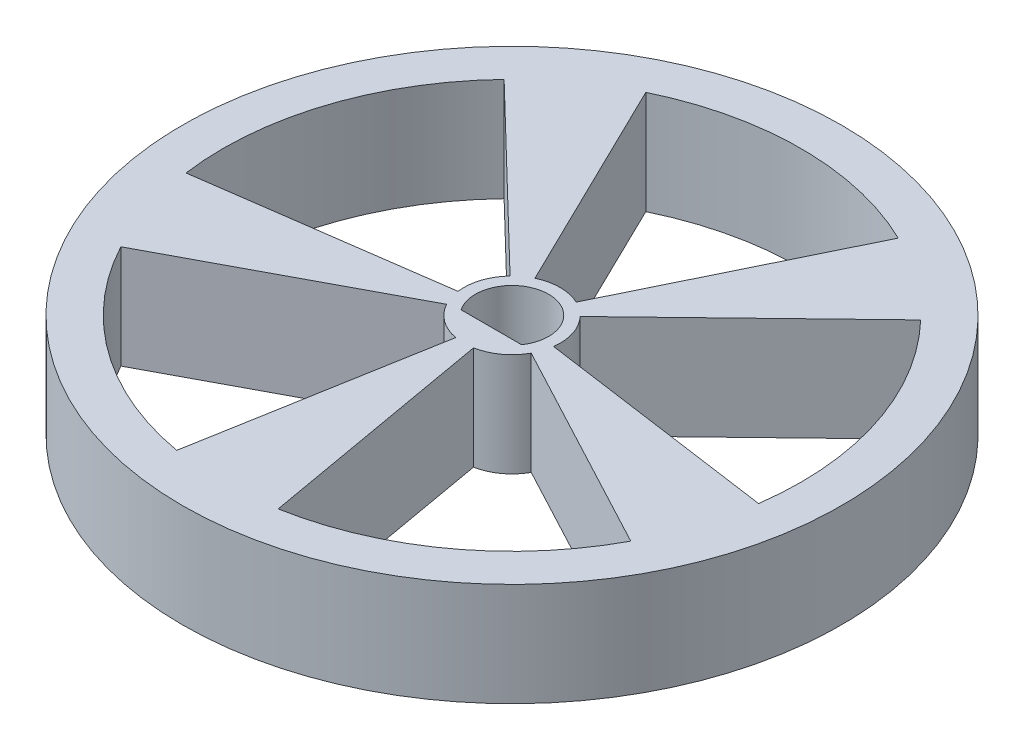
ISO-10303-21;
HEADER;
FILE_DESCRIPTION(('STEP AP214'),'2;1');
FILE_NAME('part.step','',(''),(''),'','','');
FILE_SCHEMA(('AUTOMOTIVE_DESIGN { 1 0 10303 214 1 1 1 1 }'));
ENDSEC;
DATA;
#1=APPLICATION_CONTEXT('core data for automotive mechanical design processes');
#2=APPLICATION_PROTOCOL_DEFINITION('international standard','automotive_design',2000,#1);
#3=PRODUCT_CONTEXT('',#1,'mechanical');
#4=PRODUCT('Part','Part','',(#3));
#5=PRODUCT_RELATED_PRODUCT_CATEGORY('part','',(#4));
#6=PRODUCT_DEFINITION_FORMATION('','',#4);
#7=PRODUCT_DEFINITION_CONTEXT('part definition',#1,'design');
#8=PRODUCT_DEFINITION('design','',#6,#7);
#9=PRODUCT_DEFINITION_SHAPE('','',#8);
#10=(LENGTH_UNIT() NAMED_UNIT(*) SI_UNIT(.MILLI.,.METRE.));
#11=(NAMED_UNIT(*) PLANE_ANGLE_UNIT() SI_UNIT($,.RADIAN.));
#12=(NAMED_UNIT(*) SI_UNIT($,.STERADIAN.) SOLID_ANGLE_UNIT());
#13=UNCERTAINTY_MEASURE_WITH_UNIT(LENGTH_MEASURE(1.E-05),#10,'distance_accuracy_value','');
#14=(GEOMETRIC_REPRESENTATION_CONTEXT(3) GLOBAL_UNCERTAINTY_ASSIGNED_CONTEXT((#13)) GLOBAL_UNIT_ASSIGNED_CONTEXT((#10,
#11,#12)) REPRESENTATION_CONTEXT('',''));
#15=CARTESIAN_POINT('',(0.,0.,0.));
#16=DIRECTION('',(0.,0.,1.));
#17=DIRECTION('',(1.,0.,0.));
#18=AXIS2_PLACEMENT_3D('',#15,#16,#17);
#19=CARTESIAN_POINT('',(-0.0194735546445685,3.81,-0.00343371309413793));
#20=DIRECTION('',(-0.984807753012209,0.,-0.173648177666923));
#21=DIRECTION('',(-0.173648177666923,0.,0.984807753012209));
#22=AXIS2_PLACEMENT_3D('',#19,#20,#21);
#23=PLANE('',#22);
#24=DIRECTION('',(0.173648177666923,0.,-0.984807753012209));
#25=VECTOR('',#24,1.);
#26=CARTESIAN_POINT('',(-0.0194735546445685,0.,-0.00343371309413793));
#27=LINE('',#26,#25);
#28=CARTESIAN_POINT('',(-1.87031075779216,0.,10.4931856681893));
#29=VERTEX_POINT('',#28);
#30=CARTESIAN_POINT('',(-0.32820091998509,0.,1.74744618118011));
#31=VERTEX_POINT('',#30);
#32=EDGE_CURVE('E311',#29,#31,#27,.T.);
#33=ORIENTED_EDGE('',*,*,#32,.F.);
#34=DIRECTION('',(0.,-1.,0.));
#35=VECTOR('',#34,1.);
#36=CARTESIAN_POINT('',(-1.87031075779216,3.81,10.4931856681893));
#37=LINE('',#36,#35);
#38=CARTESIAN_POINT('',(-1.87031075779216,3.81,10.4931856681893));
#39=VERTEX_POINT('',#38);
#40=EDGE_CURVE('E47',#39,#29,#37,.T.);
#41=ORIENTED_EDGE('',*,*,#40,.F.);
#42=DIRECTION('',(0.173648177666923,0.,-0.984807753012209));
#43=VECTOR('',#42,1.);
#44=CARTESIAN_POINT('',(-0.0194735546445685,3.81,-0.00343371309413793));
#45=LINE('',#44,#43);
#46=CARTESIAN_POINT('',(-0.32820091998509,3.81,1.74744618118011));
#47=VERTEX_POINT('',#46);
#48=EDGE_CURVE('E218',#39,#47,#45,.T.);
#49=ORIENTED_EDGE('',*,*,#48,.T.);
#50=DIRECTION('',(0.,-1.,0.));
#51=VECTOR('',#50,1.);
#52=CARTESIAN_POINT('',(-0.32820091998509,3.81,1.74744618118011));
#53=LINE('',#52,#51);
#54=EDGE_CURVE('E135',#47,#31,#53,.T.);
#55=ORIENTED_EDGE('',*,*,#54,.T.);
#56=EDGE_LOOP('',(#33,#41,#49,#55));
#57=FACE_BOUND('',#56,.T.);
#58=ADVANCED_FACE('F41',(#57),#23,.T.);
#59=CARTESIAN_POINT('',(0.,3.81,0.));
#60=DIRECTION('',(0.,-1.,0.));
#61=DIRECTION('',(0.,0.,-1.));
#62=AXIS2_PLACEMENT_3D('',#59,#60,#61);
#63=CYLINDRICAL_SURFACE('',#62,10.6585649971188);
#64=CARTESIAN_POINT('',(0.,0.,0.));
#65=DIRECTION('',(0.,1.,0.));
#66=DIRECTION('',(0.,0.,1.));
#67=AXIS2_PLACEMENT_3D('',#64,#65,#66);
#68=CIRCLE('',#67,10.6585649971188);
#69=CARTESIAN_POINT('',(-9.40165479750631,0.,5.02134393029727));
#70=VERTEX_POINT('',#69);
#71=EDGE_CURVE('E202',#70,#29,#68,.T.);
#72=ORIENTED_EDGE('',*,*,#71,.F.);
#73=DIRECTION('',(0.,-1.,0.));
#74=VECTOR('',#73,1.);
#75=CARTESIAN_POINT('',(-9.40165479750631,3.81,5.02134393029727));
#76=LINE('',#75,#74);
#77=CARTESIAN_POINT('',(-9.40165479750631,3.81,5.02134393029727));
#78=VERTEX_POINT('',#77);
#79=EDGE_CURVE('E199',#78,#70,#76,.T.);
#80=ORIENTED_EDGE('',*,*,#79,.F.);
#81=CARTESIAN_POINT('',(0.,3.81,0.));
#82=DIRECTION('',(0.,1.,0.));
#83=DIRECTION('',(0.,0.,1.));
#84=AXIS2_PLACEMENT_3D('',#81,#82,#83);
#85=CIRCLE('',#84,10.6585649971188);
#86=EDGE_CURVE('E205',#78,#39,#85,.T.);
#87=ORIENTED_EDGE('',*,*,#86,.T.);
#88=ORIENTED_EDGE('',*,*,#40,.T.);
#89=EDGE_LOOP('',(#72,#80,#87,#88));
#90=FACE_BOUND('',#89,.T.);
#91=ADVANCED_FACE('F204',(#90),#63,.F.);
#92=CARTESIAN_POINT('',(0.00928331453932777,3.81,0.0174593753402485));
#93=DIRECTION('',(-0.469471562785882,0.,-0.882947592858931));
#94=DIRECTION('',(-0.882947592858932,0.,0.469471562785883));
#95=AXIS2_PLACEMENT_3D('',#92,#93,#94);
#96=PLANE('',#95);
#97=DIRECTION('',(0.882947592858932,0.,-0.469471562785883));
#98=VECTOR('',#97,1.);
#99=CARTESIAN_POINT('',(0.00928331453932777,0.,0.0174593753402485));
#100=LINE('',#99,#98);
#101=CARTESIAN_POINT('',(-1.56050041564154,0.,0.852128190346135));
#102=VERTEX_POINT('',#101);
#103=EDGE_CURVE('E313',#70,#102,#100,.T.);
#104=ORIENTED_EDGE('',*,*,#103,.T.);
#105=DIRECTION('',(0.,-1.,0.));
#106=VECTOR('',#105,1.);
#107=CARTESIAN_POINT('',(-1.56050041564154,3.81,0.852128190346135));
#108=LINE('',#107,#106);
#109=CARTESIAN_POINT('',(-1.56050041564154,3.81,0.852128190346135));
#110=VERTEX_POINT('',#109);
#111=EDGE_CURVE('E209',#110,#102,#108,.T.);
#112=ORIENTED_EDGE('',*,*,#111,.F.);
#113=DIRECTION('',(0.882947592858932,0.,-0.469471562785883));
#114=VECTOR('',#113,1.);
#115=CARTESIAN_POINT('',(0.00928331453932777,3.81,0.0174593753402485));
#116=LINE('',#115,#114);
#117=EDGE_CURVE('E215',#78,#110,#116,.T.);
#118=ORIENTED_EDGE('',*,*,#117,.F.);
#119=ORIENTED_EDGE('',*,*,#79,.T.);
#120=EDGE_LOOP('',(#104,#112,#118,#119));
#121=FACE_BOUND('',#120,.T.);
#122=ADVANCED_FACE('F214',(#121),#96,.F.);
#123=CARTESIAN_POINT('',(-0.013736150731006,3.81,0.0142242004767529));
#124=DIRECTION('',(0.694658370459006,0.,-0.719339800338643));
#125=DIRECTION('',(-0.719339800338643,0.,-0.694658370459006));
#126=AXIS2_PLACEMENT_3D('',#123,#124,#125);
#127=PLANE('',#126);
#128=DIRECTION('',(0.719339800338643,0.,0.694658370459006));
#129=VECTOR('',#128,1.);
#130=CARTESIAN_POINT('',(-0.013736150731006,0.,0.0142242004767529));
#131=LINE('',#130,#129);
#132=CARTESIAN_POINT('',(-7.68085297314452,0.,-7.38982445006264));
#133=VERTEX_POINT('',#132);
#134=CARTESIAN_POINT('',(-1.29264321630989,0.,-1.22080199677426));
#135=VERTEX_POINT('',#134);
#136=EDGE_CURVE('E301',#133,#135,#131,.T.);
#137=ORIENTED_EDGE('',*,*,#136,.T.);
#138=DIRECTION('',(0.,-1.,0.));
#139=VECTOR('',#138,1.);
#140=CARTESIAN_POINT('',(-1.29264321630989,3.81,-1.22080199677426));
#141=LINE('',#140,#139);
#142=CARTESIAN_POINT('',(-1.29264321630989,3.81,-1.22080199677426));
#143=VERTEX_POINT('',#142);
#144=EDGE_CURVE('E324',#143,#135,#141,.T.);
#145=ORIENTED_EDGE('',*,*,#144,.F.);
#146=DIRECTION('',(0.719339800338643,0.,0.694658370459006));
#147=VECTOR('',#146,1.);
#148=CARTESIAN_POINT('',(-0.013736150731006,3.81,0.0142242004767529));
#149=LINE('',#148,#147);
#150=CARTESIAN_POINT('',(-7.68085297314452,3.81,-7.38982445006264));
#151=VERTEX_POINT('',#150);
#152=EDGE_CURVE('E252',#151,#143,#149,.T.);
#153=ORIENTED_EDGE('',*,*,#152,.F.);
#154=DIRECTION('',(0.,-1.,0.));
#155=VECTOR('',#154,1.);
#156=CARTESIAN_POINT('',(-7.68085297314452,3.81,-7.38982445006264));
#157=LINE('',#156,#155);
#158=EDGE_CURVE('E327',#151,#133,#157,.T.);
#159=ORIENTED_EDGE('',*,*,#158,.T.);
#160=EDGE_LOOP('',(#137,#145,#153,#159));
#161=FACE_BOUND('',#160,.T.);
#162=ADVANCED_FACE('F399',(#161),#127,.F.);
#163=CARTESIAN_POINT('',(0.,3.81,0.));
#164=DIRECTION('',(0.,-1.,0.));
#165=DIRECTION('',(0.,0.,-1.));
#166=AXIS2_PLACEMENT_3D('',#163,#164,#165);
#167=CYLINDRICAL_SURFACE('',#166,1.778);
#168=CARTESIAN_POINT('',(0.,0.,0.));
#169=DIRECTION('',(0.,1.,0.));
#170=DIRECTION('',(0.,0.,1.));
#171=AXIS2_PLACEMENT_3D('',#168,#169,#170);
#172=CIRCLE('',#171,1.778);
#173=CARTESIAN_POINT('',(-1.76333973933131,0.,0.227852943134368));
#174=VERTEX_POINT('',#173);
#175=EDGE_CURVE('E302',#135,#174,#172,.T.);
#176=ORIENTED_EDGE('',*,*,#175,.T.);
#177=DIRECTION('',(0.,-1.,0.));
#178=VECTOR('',#177,1.);
#179=CARTESIAN_POINT('',(-1.76333973933131,3.81,0.227852943134368));
#180=LINE('',#179,#178);
#181=CARTESIAN_POINT('',(-1.76333973933131,3.81,0.227852943134368));
#182=VERTEX_POINT('',#181);
#183=EDGE_CURVE('E334',#182,#174,#180,.T.);
#184=ORIENTED_EDGE('',*,*,#183,.F.);
#185=CARTESIAN_POINT('',(0.,3.81,0.));
#186=DIRECTION('',(0.,1.,0.));
#187=DIRECTION('',(0.,0.,1.));
#188=AXIS2_PLACEMENT_3D('',#185,#186,#187);
#189=CIRCLE('',#188,1.778);
#190=EDGE_CURVE('E258',#143,#182,#189,.T.);
#191=ORIENTED_EDGE('',*,*,#190,.F.);
#192=ORIENTED_EDGE('',*,*,#144,.T.);
#193=EDGE_LOOP('',(#176,#184,#191,#192));
#194=FACE_BOUND('',#193,.T.);
#195=ADVANCED_FACE('F395',(#194),#167,.T.);
#196=CARTESIAN_POINT('',(-0.0027520041127929,3.81,-0.0195815267400428));
#197=DIRECTION('',(-0.13917310096007,0.,-0.99026806874157));
#198=DIRECTION('',(-0.99026806874157,0.,0.13917310096007));
#199=AXIS2_PLACEMENT_3D('',#196,#197,#198);
#200=PLANE('',#199);
#201=DIRECTION('',(0.99026806874157,0.,-0.13917310096007));
#202=VECTOR('',#201,1.);
#203=CARTESIAN_POINT('',(-0.0027520041127929,0.,-0.0195815267400428));
#204=LINE('',#203,#202);
#205=CARTESIAN_POINT('',(-10.5575704153464,0.,1.46380146290695));
#206=VERTEX_POINT('',#205);
#207=EDGE_CURVE('E310',#206,#174,#204,.T.);
#208=ORIENTED_EDGE('',*,*,#207,.F.);
#209=DIRECTION('',(0.,-1.,0.));
#210=VECTOR('',#209,1.);
#211=CARTESIAN_POINT('',(-10.5575704153464,3.81,1.46380146290695));
#212=LINE('',#211,#210);
#213=CARTESIAN_POINT('',(-10.5575704153464,3.81,1.46380146290695));
#214=VERTEX_POINT('',#213);
#215=EDGE_CURVE('E328',#214,#206,#212,.T.);
#216=ORIENTED_EDGE('',*,*,#215,.F.);
#217=DIRECTION('',(0.99026806874157,0.,-0.13917310096007));
#218=VECTOR('',#217,1.);
#219=CARTESIAN_POINT('',(-0.0027520041127929,3.81,-0.0195815267400428));
#220=LINE('',#219,#218);
#221=EDGE_CURVE('E228',#214,#182,#220,.T.);
#222=ORIENTED_EDGE('',*,*,#221,.T.);
#223=ORIENTED_EDGE('',*,*,#183,.T.);
#224=EDGE_LOOP('',(#208,#216,#222,#223));
#225=FACE_BOUND('',#224,.T.);
#226=ADVANCED_FACE('F389',(#225),#200,.T.);
#227=CARTESIAN_POINT('',(0.,3.81,0.));
#228=DIRECTION('',(0.,-1.,0.));
#229=DIRECTION('',(0.,0.,-1.));
#230=AXIS2_PLACEMENT_3D('',#227,#228,#229);
#231=CYLINDRICAL_SURFACE('',#230,1.778);
#232=CARTESIAN_POINT('',(0.,0.,0.));
#233=DIRECTION('',(0.,1.,0.));
#234=DIRECTION('',(0.,0.,1.));
#235=AXIS2_PLACEMENT_3D('',#232,#233,#234);
#236=CIRCLE('',#235,1.778);
#237=CARTESIAN_POINT('',(0.328200919985089,0.,1.74744618118011));
#238=VERTEX_POINT('',#237);
#239=CARTESIAN_POINT('',(1.56050041564153,0.,0.852128190346158));
#240=VERTEX_POINT('',#239);
#241=EDGE_CURVE('E292',#238,#240,#236,.T.);
#242=ORIENTED_EDGE('',*,*,#241,.T.);
#243=DIRECTION('',(0.,-1.,0.));
#244=VECTOR('',#243,1.);
#245=CARTESIAN_POINT('',(1.56050041564153,3.81,0.852128190346158));
#246=LINE('',#245,#244);
#247=CARTESIAN_POINT('',(1.56050041564153,3.81,0.852128190346158));
#248=VERTEX_POINT('',#247);
#249=EDGE_CURVE('E329',#248,#240,#246,.T.);
#250=ORIENTED_EDGE('',*,*,#249,.F.);
#251=CARTESIAN_POINT('',(0.,3.81,0.));
#252=DIRECTION('',(0.,1.,0.));
#253=DIRECTION('',(0.,0.,1.));
#254=AXIS2_PLACEMENT_3D('',#251,#252,#253);
#255=CIRCLE('',#254,1.778);
#256=CARTESIAN_POINT('',(0.328200919985089,3.81,1.74744618118011));
#257=VERTEX_POINT('',#256);
#258=EDGE_CURVE('E237',#257,#248,#255,.T.);
#259=ORIENTED_EDGE('',*,*,#258,.F.);
#260=DIRECTION('',(0.,-1.,0.));
#261=VECTOR('',#260,1.);
#262=CARTESIAN_POINT('',(0.328200919985089,3.81,1.74744618118011));
#263=LINE('',#262,#261);
#264=EDGE_CURVE('E332',#257,#238,#263,.T.);
#265=ORIENTED_EDGE('',*,*,#264,.T.);
#266=EDGE_LOOP('',(#242,#250,#259,#265));
#267=FACE_BOUND('',#266,.T.);
#268=ADVANCED_FACE('F392',(#267),#231,.T.);
#269=CARTESIAN_POINT('',(-0.00928331453932883,3.81,0.0174593753402499));
#270=DIRECTION('',(-0.469471562785894,0.,0.882947592858925));
#271=DIRECTION('',(0.882947592858925,0.,0.469471562785895));
#272=AXIS2_PLACEMENT_3D('',#269,#270,#271);
#273=PLANE('',#272);
#274=DIRECTION('',(-0.882947592858925,0.,-0.469471562785895));
#275=VECTOR('',#274,1.);
#276=CARTESIAN_POINT('',(-0.00928331453932883,0.,0.0174593753402499));
#277=LINE('',#276,#275);
#278=CARTESIAN_POINT('',(9.40165479750624,0.,5.0213439302974));
#279=VERTEX_POINT('',#278);
#280=EDGE_CURVE('E294',#279,#240,#277,.T.);
#281=ORIENTED_EDGE('',*,*,#280,.F.);
#282=DIRECTION('',(0.,-1.,0.));
#283=VECTOR('',#282,1.);
#284=CARTESIAN_POINT('',(9.40165479750624,3.81,5.0213439302974));
#285=LINE('',#284,#283);
#286=CARTESIAN_POINT('',(9.40165479750624,3.81,5.0213439302974));
#287=VERTEX_POINT('',#286);
#288=EDGE_CURVE('E342',#287,#279,#285,.T.);
#289=ORIENTED_EDGE('',*,*,#288,.F.);
#290=DIRECTION('',(-0.882947592858925,0.,-0.469471562785895));
#291=VECTOR('',#290,1.);
#292=CARTESIAN_POINT('',(-0.00928331453932883,3.81,0.0174593753402499));
#293=LINE('',#292,#291);
#294=EDGE_CURVE('E243',#287,#248,#293,.T.);
#295=ORIENTED_EDGE('',*,*,#294,.T.);
#296=ORIENTED_EDGE('',*,*,#249,.T.);
#297=EDGE_LOOP('',(#281,#289,#295,#296));
#298=FACE_BOUND('',#297,.T.);
#299=ADVANCED_FACE('F407',(#298),#273,.T.);
#300=CARTESIAN_POINT('',(1.87031075779216,0.,10.4931856681893));
#301=VERTEX_POINT('',#300);
#302=EDGE_CURVE('E296',#301,#279,#68,.T.);
#303=ORIENTED_EDGE('',*,*,#302,.F.);
#304=DIRECTION('',(0.,-1.,0.));
#305=VECTOR('',#304,1.);
#306=CARTESIAN_POINT('',(1.87031075779216,3.81,10.4931856681893));
#307=LINE('',#306,#305);
#308=CARTESIAN_POINT('',(1.87031075779216,3.81,10.4931856681893));
#309=VERTEX_POINT('',#308);
#310=EDGE_CURVE('E336',#309,#301,#307,.T.);
#311=ORIENTED_EDGE('',*,*,#310,.F.);
#312=EDGE_CURVE('E227',#309,#287,#85,.T.);
#313=ORIENTED_EDGE('',*,*,#312,.T.);
#314=ORIENTED_EDGE('',*,*,#288,.T.);
#315=EDGE_LOOP('',(#303,#311,#313,#314));
#316=FACE_BOUND('',#315,.T.);
#317=ADVANCED_FACE('F406',(#316),#63,.F.);
#318=CARTESIAN_POINT('',(0.00275200411279299,3.81,-0.0195815267400415));
#319=DIRECTION('',(-0.139173100960083,0.,0.990268068741568));
#320=DIRECTION('',(0.990268068741568,0.,0.139173100960083));
#321=AXIS2_PLACEMENT_3D('',#318,#319,#320);
#322=PLANE('',#321);
#323=DIRECTION('',(-0.990268068741568,0.,-0.139173100960083));
#324=VECTOR('',#323,1.);
#325=CARTESIAN_POINT('',(0.00275200411279299,0.,-0.0195815267400415));
#326=LINE('',#325,#324);
#327=CARTESIAN_POINT('',(10.5575704153464,0.,1.46380146290709));
#328=VERTEX_POINT('',#327);
#329=CARTESIAN_POINT('',(1.76333973933131,0.,0.227852943134393));
#330=VERTEX_POINT('',#329);
#331=EDGE_CURVE('E285',#328,#330,#326,.T.);
#332=ORIENTED_EDGE('',*,*,#331,.T.);
#333=DIRECTION('',(0.,-1.,0.));
#334=VECTOR('',#333,1.);
#335=CARTESIAN_POINT('',(1.76333973933131,3.81,0.227852943134393));
#336=LINE('',#335,#334);
#337=CARTESIAN_POINT('',(1.76333973933131,3.81,0.227852943134393));
#338=VERTEX_POINT('',#337);
#339=EDGE_CURVE('E339',#338,#330,#336,.T.);
#340=ORIENTED_EDGE('',*,*,#339,.F.);
#341=DIRECTION('',(-0.990268068741568,0.,-0.139173100960083));
#342=VECTOR('',#341,1.);
#343=CARTESIAN_POINT('',(0.00275200411279299,3.81,-0.0195815267400415));
#344=LINE('',#343,#342);
#345=CARTESIAN_POINT('',(10.5575704153464,3.81,1.46380146290709));
#346=VERTEX_POINT('',#345);
#347=EDGE_CURVE('E230',#346,#338,#344,.T.);
#348=ORIENTED_EDGE('',*,*,#347,.F.);
#349=DIRECTION('',(0.,-1.,0.));
#350=VECTOR('',#349,1.);
#351=CARTESIAN_POINT('',(10.5575704153464,3.81,1.46380146290709));
#352=LINE('',#351,#350);
#353=EDGE_CURVE('E341',#346,#328,#352,.T.);
#354=ORIENTED_EDGE('',*,*,#353,.T.);
#355=EDGE_LOOP('',(#332,#340,#348,#354));
#356=FACE_BOUND('',#355,.T.);
#357=ADVANCED_FACE('F423',(#356),#322,.F.);
#358=CARTESIAN_POINT('',(0.,3.81,0.));
#359=DIRECTION('',(0.,-1.,0.));
#360=DIRECTION('',(0.,0.,-1.));
#361=AXIS2_PLACEMENT_3D('',#358,#359,#360);
#362=CYLINDRICAL_SURFACE('',#361,1.778);
#363=CARTESIAN_POINT('',(0.,0.,0.));
#364=DIRECTION('',(0.,1.,0.));
#365=DIRECTION('',(0.,0.,1.));
#366=AXIS2_PLACEMENT_3D('',#363,#364,#365);
#367=CIRCLE('',#366,1.778);
#368=CARTESIAN_POINT('',(1.29264321630991,0.,-1.22080199677424));
#369=VERTEX_POINT('',#368);
#370=EDGE_CURVE('E289',#330,#369,#367,.T.);
#371=ORIENTED_EDGE('',*,*,#370,.T.);
#372=DIRECTION('',(0.,-1.,0.));
#373=VECTOR('',#372,1.);
#374=CARTESIAN_POINT('',(1.29264321630991,3.81,-1.22080199677424));
#375=LINE('',#374,#373);
#376=CARTESIAN_POINT('',(1.29264321630991,3.81,-1.22080199677424));
#377=VERTEX_POINT('',#376);
#378=EDGE_CURVE('E349',#377,#369,#375,.T.);
#379=ORIENTED_EDGE('',*,*,#378,.F.);
#380=CARTESIAN_POINT('',(0.,3.81,0.));
#381=DIRECTION('',(0.,1.,0.));
#382=DIRECTION('',(0.,0.,1.));
#383=AXIS2_PLACEMENT_3D('',#380,#381,#382);
#384=CIRCLE('',#383,1.778);
#385=EDGE_CURVE('E232',#338,#377,#384,.T.);
#386=ORIENTED_EDGE('',*,*,#385,.F.);
#387=ORIENTED_EDGE('',*,*,#339,.T.);
#388=EDGE_LOOP('',(#371,#379,#386,#387));
#389=FACE_BOUND('',#388,.T.);
#390=ADVANCED_FACE('F416',(#389),#362,.T.);
#391=CARTESIAN_POINT('',(0.0137361507310076,3.81,0.0142242004767549));
#392=DIRECTION('',(0.694658370458996,0.,0.719339800338652));
#393=DIRECTION('',(0.719339800338652,0.,-0.694658370458996));
#394=AXIS2_PLACEMENT_3D('',#391,#392,#393);
#395=PLANE('',#394);
#396=DIRECTION('',(-0.719339800338652,0.,0.694658370458996));
#397=VECTOR('',#396,1.);
#398=CARTESIAN_POINT('',(0.0137361507310076,0.,0.0142242004767549));
#399=LINE('',#398,#397);
#400=CARTESIAN_POINT('',(7.68085297314463,0.,-7.38982445006253));
#401=VERTEX_POINT('',#400);
#402=EDGE_CURVE('E288',#401,#369,#399,.T.);
#403=ORIENTED_EDGE('',*,*,#402,.F.);
#404=DIRECTION('',(0.,-1.,0.));
#405=VECTOR('',#404,1.);
#406=CARTESIAN_POINT('',(7.68085297314463,3.81,-7.38982445006253));
#407=LINE('',#406,#405);
#408=CARTESIAN_POINT('',(7.68085297314463,3.81,-7.38982445006253));
#409=VERTEX_POINT('',#408);
#410=EDGE_CURVE('E347',#409,#401,#407,.T.);
#411=ORIENTED_EDGE('',*,*,#410,.F.);
#412=DIRECTION('',(-0.719339800338652,0.,0.694658370458996));
#413=VECTOR('',#412,1.);
#414=CARTESIAN_POINT('',(0.0137361507310076,3.81,0.0142242004767549));
#415=LINE('',#414,#413);
#416=EDGE_CURVE('E239',#409,#377,#415,.T.);
#417=ORIENTED_EDGE('',*,*,#416,.T.);
#418=ORIENTED_EDGE('',*,*,#378,.T.);
#419=EDGE_LOOP('',(#403,#411,#417,#418));
#420=FACE_BOUND('',#419,.T.);
#421=ADVANCED_FACE('F413',(#420),#395,.T.);
#422=CARTESIAN_POINT('',(-0.0177727225656827,3.81,-0.00866833598282365));
#423=DIRECTION('',(0.89879404629916,0.,0.438371146789091));
#424=DIRECTION('',(0.438371146789091,0.,-0.89879404629916));
#425=AXIS2_PLACEMENT_3D('',#422,#423,#424);
#426=PLANE('',#425);
#427=DIRECTION('',(-0.438371146789091,0.,0.89879404629916));
#428=VECTOR('',#427,1.);
#429=CARTESIAN_POINT('',(-0.0177727225656827,0.,-0.00866833598282365));
#430=LINE('',#429,#428);
#431=CARTESIAN_POINT('',(4.65462659751236,0.,-9.58850661133094));
#432=VERTEX_POINT('',#431);
#433=CARTESIAN_POINT('',(0.761602972635052,0.,-1.60662531788636));
#434=VERTEX_POINT('',#433);
#435=EDGE_CURVE('E268',#432,#434,#430,.T.);
#436=ORIENTED_EDGE('',*,*,#435,.T.);
#437=DIRECTION('',(0.,-1.,0.));
#438=VECTOR('',#437,1.);
#439=CARTESIAN_POINT('',(0.761602972635052,3.81,-1.60662531788636));
#440=LINE('',#439,#438);
#441=CARTESIAN_POINT('',(0.761602972635052,3.81,-1.60662531788636));
#442=VERTEX_POINT('',#441);
#443=EDGE_CURVE('E350',#442,#434,#440,.T.);
#444=ORIENTED_EDGE('',*,*,#443,.F.);
#445=DIRECTION('',(-0.438371146789091,0.,0.89879404629916));
#446=VECTOR('',#445,1.);
#447=CARTESIAN_POINT('',(-0.0177727225656827,3.81,-0.00866833598282365));
#448=LINE('',#447,#446);
#449=CARTESIAN_POINT('',(4.65462659751236,3.81,-9.58850661133094));
#450=VERTEX_POINT('',#449);
#451=EDGE_CURVE('E453',#450,#442,#448,.T.);
#452=ORIENTED_EDGE('',*,*,#451,.F.);
#453=DIRECTION('',(0.,-1.,0.));
#454=VECTOR('',#453,1.);
#455=CARTESIAN_POINT('',(4.65462659751236,3.81,-9.58850661133094));
#456=LINE('',#455,#454);
#457=EDGE_CURVE('E355',#450,#432,#456,.T.);
#458=ORIENTED_EDGE('',*,*,#457,.T.);
#459=EDGE_LOOP('',(#436,#444,#452,#458));
#460=FACE_BOUND('',#459,.T.);
#461=ADVANCED_FACE('F419',(#460),#426,.F.);
#462=CARTESIAN_POINT('',(0.,3.81,0.));
#463=DIRECTION('',(0.,-1.,0.));
#464=DIRECTION('',(0.,0.,-1.));
#465=AXIS2_PLACEMENT_3D('',#462,#463,#464);
#466=CYLINDRICAL_SURFACE('',#465,1.778);
#467=CARTESIAN_POINT('',(0.,0.,0.));
#468=DIRECTION('',(0.,1.,0.));
#469=DIRECTION('',(0.,0.,1.));
#470=AXIS2_PLACEMENT_3D('',#467,#468,#469);
#471=CIRCLE('',#470,1.778);
#472=CARTESIAN_POINT('',(-0.761602972635029,0.,-1.60662531788637));
#473=VERTEX_POINT('',#472);
#474=EDGE_CURVE('E275',#434,#473,#471,.T.);
#475=ORIENTED_EDGE('',*,*,#474,.T.);
#476=DIRECTION('',(0.,-1.,0.));
#477=VECTOR('',#476,1.);
#478=CARTESIAN_POINT('',(-0.761602972635029,3.81,-1.60662531788637));
#479=LINE('',#478,#477);
#480=CARTESIAN_POINT('',(-0.761602972635029,3.81,-1.60662531788637));
#481=VERTEX_POINT('',#480);
#482=EDGE_CURVE('E357',#481,#473,#479,.T.);
#483=ORIENTED_EDGE('',*,*,#482,.F.);
#484=CARTESIAN_POINT('',(0.,3.81,0.));
#485=DIRECTION('',(0.,1.,0.));
#486=DIRECTION('',(0.,0.,1.));
#487=AXIS2_PLACEMENT_3D('',#484,#485,#486);
#488=CIRCLE('',#487,1.778);
#489=EDGE_CURVE('E240',#442,#481,#488,.T.);
#490=ORIENTED_EDGE('',*,*,#489,.F.);
#491=ORIENTED_EDGE('',*,*,#443,.T.);
#492=EDGE_LOOP('',(#475,#483,#490,#491));
#493=FACE_BOUND('',#492,.T.);
#494=ADVANCED_FACE('F429',(#493),#466,.T.);
#495=CARTESIAN_POINT('',(0.0177727225656828,3.81,-0.0086683359828234));
#496=DIRECTION('',(0.898794046299166,0.,-0.438371146789079));
#497=DIRECTION('',(-0.438371146789079,0.,-0.898794046299166));
#498=AXIS2_PLACEMENT_3D('',#495,#496,#497);
#499=PLANE('',#498);
#500=DIRECTION('',(0.438371146789079,0.,0.898794046299166));
#501=VECTOR('',#500,1.);
#502=CARTESIAN_POINT('',(0.0177727225656828,0.,-0.0086683359828234));
#503=LINE('',#502,#501);
#504=CARTESIAN_POINT('',(-4.65462659751222,0.,-9.58850661133101));
#505=VERTEX_POINT('',#504);
#506=EDGE_CURVE('E277',#505,#473,#503,.T.);
#507=ORIENTED_EDGE('',*,*,#506,.F.);
#508=DIRECTION('',(0.,-1.,0.));
#509=VECTOR('',#508,1.);
#510=CARTESIAN_POINT('',(-4.65462659751222,3.81,-9.58850661133101));
#511=LINE('',#510,#509);
#512=CARTESIAN_POINT('',(-4.65462659751222,3.81,-9.58850661133101));
#513=VERTEX_POINT('',#512);
#514=EDGE_CURVE('E352',#513,#505,#511,.T.);
#515=ORIENTED_EDGE('',*,*,#514,.F.);
#516=DIRECTION('',(0.438371146789079,0.,0.898794046299166));
#517=VECTOR('',#516,1.);
#518=CARTESIAN_POINT('',(0.0177727225656828,3.81,-0.0086683359828234));
#519=LINE('',#518,#517);
#520=EDGE_CURVE('E229',#513,#481,#519,.T.);
#521=ORIENTED_EDGE('',*,*,#520,.T.);
#522=ORIENTED_EDGE('',*,*,#482,.T.);
#523=EDGE_LOOP('',(#507,#515,#521,#522));
#524=FACE_BOUND('',#523,.T.);
#525=ADVANCED_FACE('F428',(#524),#499,.T.);
#526=CARTESIAN_POINT('',(0.,3.81,0.));
#527=DIRECTION('',(0.,-1.,0.));
#528=DIRECTION('',(0.,0.,-1.));
#529=AXIS2_PLACEMENT_3D('',#526,#527,#528);
#530=CYLINDRICAL_SURFACE('',#529,1.35072871906906);
#531=CARTESIAN_POINT('',(0.,0.254,0.));
#532=DIRECTION('',(0.,1.,0.));
#533=DIRECTION('',(0.,0.,1.));
#534=AXIS2_PLACEMENT_3D('',#531,#532,#533);
#535=CIRCLE('',#534,1.35072871906906);
#536=CARTESIAN_POINT('',(1.11526861002987,0.254,0.762));
#537=VERTEX_POINT('',#536);
#538=CARTESIAN_POINT('',(-1.11526861002987,0.254000000000001,0.762));
#539=VERTEX_POINT('',#538);
#540=EDGE_CURVE('E271',#537,#539,#535,.T.);
#541=ORIENTED_EDGE('',*,*,#540,.F.);
#542=DIRECTION('',(0.,-1.,0.));
#543=VECTOR('',#542,1.);
#544=CARTESIAN_POINT('',(1.11526861002987,3.81,0.762));
#545=LINE('',#544,#543);
#546=CARTESIAN_POINT('',(1.11526861002987,3.81,0.762));
#547=VERTEX_POINT('',#546);
#548=EDGE_CURVE('E137',#547,#537,#545,.T.);
#549=ORIENTED_EDGE('',*,*,#548,.F.);
#550=CARTESIAN_POINT('',(0.,3.81,0.));
#551=DIRECTION('',(0.,1.,0.));
#552=DIRECTION('',(0.,0.,1.));
#553=AXIS2_PLACEMENT_3D('',#550,#551,#552);
#554=CIRCLE('',#553,1.35072871906906);
#555=CARTESIAN_POINT('',(-1.11526861002987,3.81,0.762));
#556=VERTEX_POINT('',#555);
#557=EDGE_CURVE('E322',#547,#556,#554,.T.);
#558=ORIENTED_EDGE('',*,*,#557,.T.);
#559=DIRECTION('',(0.,-1.,0.));
#560=VECTOR('',#559,1.);
#561=CARTESIAN_POINT('',(-1.11526861002987,3.81,0.762));
#562=LINE('',#561,#560);
#563=EDGE_CURVE('E270',#556,#539,#562,.T.);
#564=ORIENTED_EDGE('',*,*,#563,.T.);
#565=EDGE_LOOP('',(#541,#549,#558,#564));
#566=FACE_BOUND('',#565,.T.);
#567=ADVANCED_FACE('F43',(#566),#530,.F.);
#568=CARTESIAN_POINT('',(0.,3.81,0.));
#569=DIRECTION('',(0.,-1.,0.));
#570=DIRECTION('',(0.,0.,-1.));
#571=AXIS2_PLACEMENT_3D('',#568,#569,#570);
#572=CYLINDRICAL_SURFACE('',#571,1.778);
#573=CARTESIAN_POINT('',(0.,0.,0.));
#574=DIRECTION('',(0.,1.,0.));
#575=DIRECTION('',(0.,0.,1.));
#576=AXIS2_PLACEMENT_3D('',#573,#574,#575);
#577=CIRCLE('',#576,1.778);
#578=EDGE_CURVE('E317',#102,#31,#577,.T.);
#579=ORIENTED_EDGE('',*,*,#578,.T.);
#580=ORIENTED_EDGE('',*,*,#54,.F.);
#581=CARTESIAN_POINT('',(0.,3.81,0.));
#582=DIRECTION('',(0.,1.,0.));
#583=DIRECTION('',(0.,0.,1.));
#584=AXIS2_PLACEMENT_3D('',#581,#582,#583);
#585=CIRCLE('',#584,1.778);
#586=EDGE_CURVE('E64',#110,#47,#585,.T.);
#587=ORIENTED_EDGE('',*,*,#586,.F.);
#588=ORIENTED_EDGE('',*,*,#111,.T.);
#589=EDGE_LOOP('',(#579,#580,#587,#588));
#590=FACE_BOUND('',#589,.T.);
#591=ADVANCED_FACE('F469',(#590),#572,.T.);
#592=EDGE_CURVE('E309',#133,#206,#68,.T.);
#593=ORIENTED_EDGE('',*,*,#592,.F.);
#594=ORIENTED_EDGE('',*,*,#158,.F.);
#595=EDGE_CURVE('E216',#151,#214,#85,.T.);
#596=ORIENTED_EDGE('',*,*,#595,.T.);
#597=ORIENTED_EDGE('',*,*,#215,.T.);
#598=EDGE_LOOP('',(#593,#594,#596,#597));
#599=FACE_BOUND('',#598,.T.);
#600=ADVANCED_FACE('F383',(#599),#63,.F.);
#601=CARTESIAN_POINT('',(0.0194735546445672,3.81,-0.00343371309413771));
#602=DIRECTION('',(-0.984807753012209,0.,0.173648177666924));
#603=DIRECTION('',(0.173648177666924,0.,0.984807753012209));
#604=AXIS2_PLACEMENT_3D('',#601,#602,#603);
#605=PLANE('',#604);
#606=DIRECTION('',(-0.173648177666924,0.,-0.984807753012209));
#607=VECTOR('',#606,1.);
#608=CARTESIAN_POINT('',(0.0194735546445672,0.,-0.00343371309413771));
#609=LINE('',#608,#607);
#610=EDGE_CURVE('E299',#301,#238,#609,.T.);
#611=ORIENTED_EDGE('',*,*,#610,.T.);
#612=ORIENTED_EDGE('',*,*,#264,.F.);
#613=DIRECTION('',(-0.173648177666924,0.,-0.984807753012209));
#614=VECTOR('',#613,1.);
#615=CARTESIAN_POINT('',(0.0194735546445672,3.81,-0.00343371309413771));
#616=LINE('',#615,#614);
#617=EDGE_CURVE('E247',#309,#257,#616,.T.);
#618=ORIENTED_EDGE('',*,*,#617,.F.);
#619=ORIENTED_EDGE('',*,*,#310,.T.);
#620=EDGE_LOOP('',(#611,#612,#618,#619));
#621=FACE_BOUND('',#620,.T.);
#622=ADVANCED_FACE('F402',(#621),#605,.F.);
#623=EDGE_CURVE('E283',#328,#401,#68,.T.);
#624=ORIENTED_EDGE('',*,*,#623,.F.);
#625=ORIENTED_EDGE('',*,*,#353,.F.);
#626=EDGE_CURVE('E233',#346,#409,#85,.T.);
#627=ORIENTED_EDGE('',*,*,#626,.T.);
#628=ORIENTED_EDGE('',*,*,#410,.T.);
#629=EDGE_LOOP('',(#624,#625,#627,#628));
#630=FACE_BOUND('',#629,.T.);
#631=ADVANCED_FACE('F404',(#630),#63,.F.);
#632=EDGE_CURVE('E276',#432,#505,#68,.T.);
#633=ORIENTED_EDGE('',*,*,#632,.F.);
#634=ORIENTED_EDGE('',*,*,#457,.F.);
#635=EDGE_CURVE('E224',#450,#513,#85,.T.);
#636=ORIENTED_EDGE('',*,*,#635,.T.);
#637=ORIENTED_EDGE('',*,*,#514,.T.);
#638=EDGE_LOOP('',(#633,#634,#636,#637));
#639=FACE_BOUND('',#638,.T.);
#640=ADVANCED_FACE('F381',(#639),#63,.F.);
#641=CARTESIAN_POINT('',(0.,3.81,0.762));
#642=DIRECTION('',(0.,0.,-1.));
#643=DIRECTION('',(-1.,0.,0.));
#644=AXIS2_PLACEMENT_3D('',#641,#642,#643);
#645=PLANE('',#644);
#646=DIRECTION('',(1.,0.,0.));
#647=VECTOR('',#646,1.);
#648=CARTESIAN_POINT('',(0.,0.254,0.762));
#649=LINE('',#648,#647);
#650=EDGE_CURVE('E11',#539,#537,#649,.T.);
#651=ORIENTED_EDGE('',*,*,#650,.F.);
#652=ORIENTED_EDGE('',*,*,#563,.F.);
#653=DIRECTION('',(1.,0.,0.));
#654=VECTOR('',#653,1.);
#655=CARTESIAN_POINT('',(0.,3.81,0.762));
#656=LINE('',#655,#654);
#657=EDGE_CURVE('E364',#556,#547,#656,.T.);
#658=ORIENTED_EDGE('',*,*,#657,.T.);
#659=ORIENTED_EDGE('',*,*,#548,.T.);
#660=EDGE_LOOP('',(#651,#652,#658,#659));
#661=FACE_BOUND('',#660,.T.);
#662=ADVANCED_FACE('F365',(#661),#645,.T.);
#663=CARTESIAN_POINT('',(0.,3.81,0.));
#664=DIRECTION('',(0.,-1.,0.));
#665=DIRECTION('',(0.,0.,-1.));
#666=AXIS2_PLACEMENT_3D('',#663,#664,#665);
#667=CYLINDRICAL_SURFACE('',#666,12.1530599689108);
#668=CARTESIAN_POINT('',(0.,3.81,0.));
#669=DIRECTION('',(0.,1.,0.));
#670=DIRECTION('',(0.,0.,1.));
#671=AXIS2_PLACEMENT_3D('',#668,#669,#670);
#672=CIRCLE('',#671,12.1530599689108);
#673=CARTESIAN_POINT('',(0.,3.81,-12.1530599689108));
#674=VERTEX_POINT('',#673);
#675=EDGE_CURVE('E261',#674,#674,#672,.T.);
#676=CARTESIAN_POINT('',(0.,0.,0.));
#677=DIRECTION('',(0.,1.,0.));
#678=DIRECTION('',(0.,0.,1.));
#679=AXIS2_PLACEMENT_3D('',#676,#677,#678);
#680=CIRCLE('',#679,12.1530599689108);
#681=CARTESIAN_POINT('',(0.,0.,-12.1530599689108));
#682=VERTEX_POINT('',#681);
#683=EDGE_CURVE('E319',#682,#682,#680,.T.);
#684=CARTESIAN_POINT('',(0.,3.81,-12.1530599689108));
#685=CARTESIAN_POINT('',(0.,3.7703125,-12.1530599689108));
#686=CARTESIAN_POINT('',(0.,3.730625,-12.1530599689108));
#687=CARTESIAN_POINT('',(0.,3.65125,-12.1530599689108));
#688=CARTESIAN_POINT('',(0.,3.6115625,-12.1530599689108));
#689=CARTESIAN_POINT('',(0.,3.5321875,-12.1530599689108));
#690=CARTESIAN_POINT('',(0.,3.4925,-12.1530599689108));
#691=CARTESIAN_POINT('',(0.,3.413125,-12.1530599689108));
#692=CARTESIAN_POINT('',(0.,3.3734375,-12.1530599689108));
#693=CARTESIAN_POINT('',(0.,3.2940625,-12.1530599689108));
#694=CARTESIAN_POINT('',(0.,3.254375,-12.1530599689108));
#695=CARTESIAN_POINT('',(0.,3.175,-12.1530599689108));
#696=CARTESIAN_POINT('',(0.,3.1353125,-12.1530599689108));
#697=CARTESIAN_POINT('',(0.,3.0559375,-12.1530599689108));
#698=CARTESIAN_POINT('',(0.,3.01625,-12.1530599689108));
#699=CARTESIAN_POINT('',(0.,2.936875,-12.1530599689108));
#700=CARTESIAN_POINT('',(0.,2.8971875,-12.1530599689108));
#701=CARTESIAN_POINT('',(0.,2.8178125,-12.1530599689108));
#702=CARTESIAN_POINT('',(0.,2.778125,-12.1530599689108));
#703=CARTESIAN_POINT('',(0.,2.69875,-12.1530599689108));
#704=CARTESIAN_POINT('',(0.,2.6590625,-12.1530599689108));
#705=CARTESIAN_POINT('',(0.,2.5796875,-12.1530599689108));
#706=CARTESIAN_POINT('',(0.,2.54,-12.1530599689108));
#707=CARTESIAN_POINT('',(0.,2.460625,-12.1530599689108));
#708=CARTESIAN_POINT('',(0.,2.4209375,-12.1530599689108));
#709=CARTESIAN_POINT('',(0.,2.3415625,-12.1530599689108));
#710=CARTESIAN_POINT('',(0.,2.301875,-12.1530599689108));
#711=CARTESIAN_POINT('',(0.,2.2225,-12.1530599689108));
#712=CARTESIAN_POINT('',(0.,2.1828125,-12.1530599689108));
#713=CARTESIAN_POINT('',(0.,2.1034375,-12.1530599689108));
#714=CARTESIAN_POINT('',(0.,2.06375,-12.1530599689108));
#715=CARTESIAN_POINT('',(0.,1.984375,-12.1530599689108));
#716=CARTESIAN_POINT('',(0.,1.9446875,-12.1530599689108));
#717=CARTESIAN_POINT('',(0.,1.8653125,-12.1530599689108));
#718=CARTESIAN_POINT('',(0.,1.825625,-12.1530599689108));
#719=CARTESIAN_POINT('',(0.,1.74625,-12.1530599689108));
#720=CARTESIAN_POINT('',(0.,1.7065625,-12.1530599689108));
#721=CARTESIAN_POINT('',(0.,1.6271875,-12.1530599689108));
#722=CARTESIAN_POINT('',(0.,1.5875,-12.1530599689108));
#723=CARTESIAN_POINT('',(0.,1.508125,-12.1530599689108));
#724=CARTESIAN_POINT('',(0.,1.4684375,-12.1530599689108));
#725=CARTESIAN_POINT('',(0.,1.3890625,-12.1530599689108));
#726=CARTESIAN_POINT('',(0.,1.349375,-12.1530599689108));
#727=CARTESIAN_POINT('',(0.,1.27,-12.1530599689108));
#728=CARTESIAN_POINT('',(0.,1.2303125,-12.1530599689108));
#729=CARTESIAN_POINT('',(0.,1.1509375,-12.1530599689108));
#730=CARTESIAN_POINT('',(0.,1.11125,-12.1530599689108));
#731=CARTESIAN_POINT('',(0.,1.031875,-12.1530599689108));
#732=CARTESIAN_POINT('',(0.,0.9921875,-12.1530599689108));
#733=CARTESIAN_POINT('',(0.,0.9128125,-12.1530599689108));
#734=CARTESIAN_POINT('',(0.,0.873125,-12.1530599689108));
#735=CARTESIAN_POINT('',(0.,0.79375,-12.1530599689108));
#736=CARTESIAN_POINT('',(0.,0.7540625,-12.1530599689108));
#737=CARTESIAN_POINT('',(0.,0.6746875,-12.1530599689108));
#738=CARTESIAN_POINT('',(0.,0.635,-12.1530599689108));
#739=CARTESIAN_POINT('',(0.,0.555625,-12.1530599689108));
#740=CARTESIAN_POINT('',(0.,0.5159375,-12.1530599689108));
#741=CARTESIAN_POINT('',(0.,0.4365625,-12.1530599689108));
#742=CARTESIAN_POINT('',(0.,0.396875,-12.1530599689108));
#743=CARTESIAN_POINT('',(0.,0.3175,-12.1530599689108));
#744=CARTESIAN_POINT('',(0.,0.2778125,-12.1530599689108));
#745=CARTESIAN_POINT('',(0.,0.1984375,-12.1530599689108));
#746=CARTESIAN_POINT('',(0.,0.15875,-12.1530599689108));
#747=CARTESIAN_POINT('',(0.,0.0793749999999999,-12.1530599689108));
#748=CARTESIAN_POINT('',(0.,0.0396874999999999,-12.1530599689108));
#749=CARTESIAN_POINT('',(0.,0.,-12.1530599689108));
#750=B_SPLINE_CURVE_WITH_KNOTS('',3,(#684,#685,#686,#687,#688,#689,#690,#691,#692,#693,#694,
#695,#696,#697,#698,#699,#700,#701,#702,#703,#704,#705,#706,#707,#708,#709,#710,#711,#712,#713,
#714,#715,#716,#717,#718,#719,#720,#721,#722,#723,#724,#725,#726,#727,#728,#729,#730,#731,#732,
#733,#734,#735,#736,#737,#738,#739,#740,#741,#742,#743,#744,#745,#746,#747,#748,#749),
.UNSPECIFIED.,.F.,.F.,(4,2,2,2,2,2,2,2,2,2,2,2,2,2,2,2,2,2,2,2,2,2,2,2,2,2,2,2,2,2,2,2,4),(0.,
0.1190625,0.238125,0.3571875,0.47625,0.5953125,0.714375,0.8334375,0.9525,1.0715625,1.190625,
1.3096875,1.42875,1.5478125,1.666875,1.7859375,1.905,2.0240625,2.143125,2.2621875,2.38125,
2.5003125,2.619375,2.7384375,2.8575,2.9765625,3.095625,3.2146875,3.33375,3.4528125,3.571875,
3.6909375,3.81),.UNSPECIFIED.);
#751=EDGE_CURVE('BSEAM440',#674,#682,#750,.T.);
#752=ORIENTED_EDGE('',*,*,#675,.F.);
#753=ORIENTED_EDGE('',*,*,#683,.T.);
#754=ORIENTED_EDGE('',*,*,#751,.T.);
#755=ORIENTED_EDGE('',*,*,#751,.F.);
#756=EDGE_LOOP('',(#752,#754,#753,#755));
#757=FACE_BOUND('',#756,.T.);
#758=ADVANCED_FACE('F440',(#757),#667,.T.);
#759=CARTESIAN_POINT('',(0.,3.81,0.));
#760=DIRECTION('',(0.,1.,0.));
#761=DIRECTION('',(0.,0.,1.));
#762=AXIS2_PLACEMENT_3D('',#759,#760,#761);
#763=PLANE('',#762);
#764=ORIENTED_EDGE('',*,*,#557,.F.);
#765=ORIENTED_EDGE('',*,*,#657,.F.);
#766=EDGE_LOOP('',(#764,#765));
#767=FACE_BOUND('',#766,.T.);
#768=ORIENTED_EDGE('',*,*,#451,.T.);
#769=ORIENTED_EDGE('',*,*,#489,.T.);
#770=ORIENTED_EDGE('',*,*,#520,.F.);
#771=ORIENTED_EDGE('',*,*,#635,.F.);
#772=EDGE_LOOP('',(#768,#769,#770,#771));
#773=FACE_BOUND('',#772,.T.);
#774=ORIENTED_EDGE('',*,*,#347,.T.);
#775=ORIENTED_EDGE('',*,*,#385,.T.);
#776=ORIENTED_EDGE('',*,*,#416,.F.);
#777=ORIENTED_EDGE('',*,*,#626,.F.);
#778=EDGE_LOOP('',(#774,#775,#776,#777));
#779=FACE_BOUND('',#778,.T.);
#780=ORIENTED_EDGE('',*,*,#258,.T.);
#781=ORIENTED_EDGE('',*,*,#294,.F.);
#782=ORIENTED_EDGE('',*,*,#312,.F.);
#783=ORIENTED_EDGE('',*,*,#617,.T.);
#784=EDGE_LOOP('',(#780,#781,#782,#783));
#785=FACE_BOUND('',#784,.T.);
#786=ORIENTED_EDGE('',*,*,#152,.T.);
#787=ORIENTED_EDGE('',*,*,#190,.T.);
#788=ORIENTED_EDGE('',*,*,#221,.F.);
#789=ORIENTED_EDGE('',*,*,#595,.F.);
#790=EDGE_LOOP('',(#786,#787,#788,#789));
#791=FACE_BOUND('',#790,.T.);
#792=ORIENTED_EDGE('',*,*,#48,.F.);
#793=ORIENTED_EDGE('',*,*,#86,.F.);
#794=ORIENTED_EDGE('',*,*,#117,.T.);
#795=ORIENTED_EDGE('',*,*,#586,.T.);
#796=EDGE_LOOP('',(#792,#793,#794,#795));
#797=FACE_BOUND('',#796,.T.);
#798=ORIENTED_EDGE('',*,*,#675,.T.);
#799=EDGE_LOOP('',(#798));
#800=FACE_BOUND('',#799,.T.);
#801=ADVANCED_FACE('F217',(#767,#773,#779,#785,#791,#797,#800),#763,.T.);
#802=CARTESIAN_POINT('',(0.,0.,0.));
#803=DIRECTION('',(0.,1.,0.));
#804=DIRECTION('',(0.,0.,1.));
#805=AXIS2_PLACEMENT_3D('',#802,#803,#804);
#806=PLANE('',#805);
#807=ORIENTED_EDGE('',*,*,#435,.F.);
#808=ORIENTED_EDGE('',*,*,#632,.T.);
#809=ORIENTED_EDGE('',*,*,#506,.T.);
#810=ORIENTED_EDGE('',*,*,#474,.F.);
#811=EDGE_LOOP('',(#807,#808,#809,#810));
#812=FACE_BOUND('',#811,.T.);
#813=ORIENTED_EDGE('',*,*,#331,.F.);
#814=ORIENTED_EDGE('',*,*,#623,.T.);
#815=ORIENTED_EDGE('',*,*,#402,.T.);
#816=ORIENTED_EDGE('',*,*,#370,.F.);
#817=EDGE_LOOP('',(#813,#814,#815,#816));
#818=FACE_BOUND('',#817,.T.);
#819=ORIENTED_EDGE('',*,*,#241,.F.);
#820=ORIENTED_EDGE('',*,*,#610,.F.);
#821=ORIENTED_EDGE('',*,*,#302,.T.);
#822=ORIENTED_EDGE('',*,*,#280,.T.);
#823=EDGE_LOOP('',(#819,#820,#821,#822));
#824=FACE_BOUND('',#823,.T.);
#825=ORIENTED_EDGE('',*,*,#136,.F.);
#826=ORIENTED_EDGE('',*,*,#592,.T.);
#827=ORIENTED_EDGE('',*,*,#207,.T.);
#828=ORIENTED_EDGE('',*,*,#175,.F.);
#829=EDGE_LOOP('',(#825,#826,#827,#828));
#830=FACE_BOUND('',#829,.T.);
#831=ORIENTED_EDGE('',*,*,#32,.T.);
#832=ORIENTED_EDGE('',*,*,#578,.F.);
#833=ORIENTED_EDGE('',*,*,#103,.F.);
#834=ORIENTED_EDGE('',*,*,#71,.T.);
#835=EDGE_LOOP('',(#831,#832,#833,#834));
#836=FACE_BOUND('',#835,.T.);
#837=ORIENTED_EDGE('',*,*,#683,.F.);
#838=EDGE_LOOP('',(#837));
#839=FACE_BOUND('',#838,.T.);
#840=ADVANCED_FACE('F369',(#812,#818,#824,#830,#836,#839),#806,.F.);
#841=CARTESIAN_POINT('',(0.,0.254,0.));
#842=DIRECTION('',(0.,1.,0.));
#843=DIRECTION('',(0.,0.,1.));
#844=AXIS2_PLACEMENT_3D('',#841,#842,#843);
#845=PLANE('',#844);
#846=ORIENTED_EDGE('',*,*,#540,.T.);
#847=ORIENTED_EDGE('',*,*,#650,.T.);
#848=EDGE_LOOP('',(#846,#847));
#849=FACE_BOUND('',#848,.T.);
#850=ADVANCED_FACE('F368',(#849),#845,.T.);
#851=CLOSED_SHELL('',(#58,#91,#122,#162,#195,#226,#268,#299,#317,#357,#390,#421,#461,#494,#525,
#567,#591,#600,#622,#631,#640,#662,#758,#801,#840,#850));
#852=MANIFOLD_SOLID_BREP('B2',#851);
#853=ADVANCED_BREP_SHAPE_REPRESENTATION('',(#18,#852),#14);
#854=SHAPE_DEFINITION_REPRESENTATION(#9,#853);
ENDSEC;
END-ISO-10303-21;
